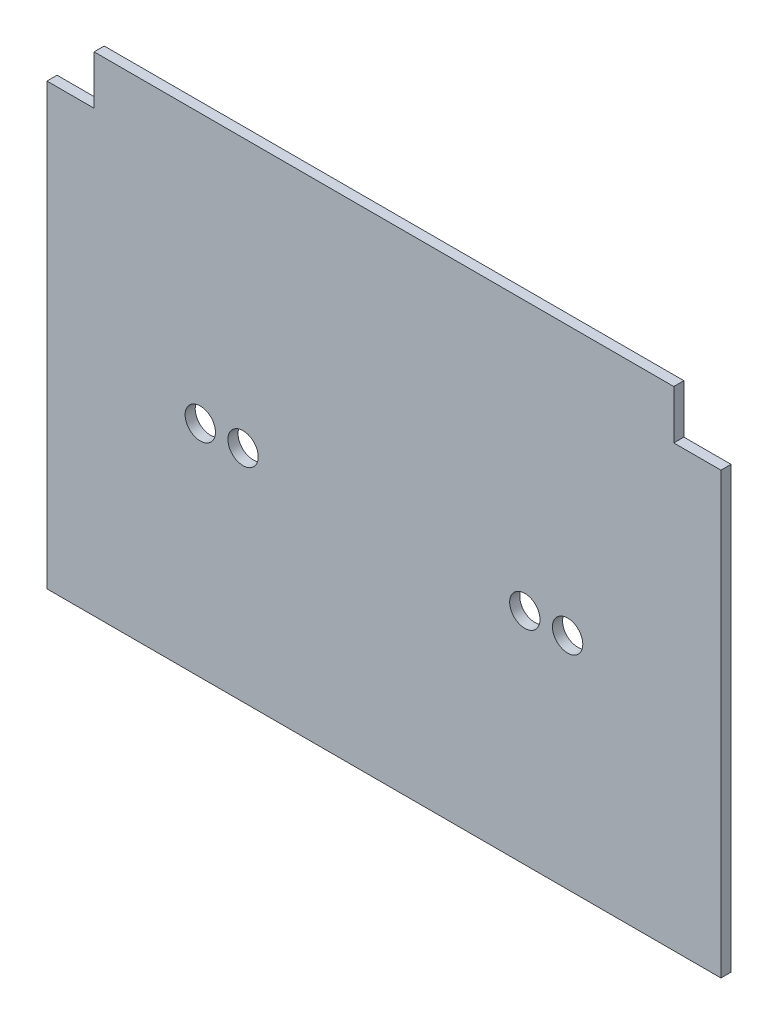
ISO-10303-21;
HEADER;
FILE_DESCRIPTION(('STEP AP214'),'2;1');
FILE_NAME('part.step','',(''),(''),'','','');
FILE_SCHEMA(('AUTOMOTIVE_DESIGN { 1 0 10303 214 1 1 1 1 }'));
ENDSEC;
DATA;
#1=APPLICATION_CONTEXT('core data for automotive mechanical design processes');
#2=APPLICATION_PROTOCOL_DEFINITION('international standard','automotive_design',2000,#1);
#3=PRODUCT_CONTEXT('',#1,'mechanical');
#4=PRODUCT('Part','Part','',(#3));
#5=PRODUCT_RELATED_PRODUCT_CATEGORY('part','',(#4));
#6=PRODUCT_DEFINITION_FORMATION('','',#4);
#7=PRODUCT_DEFINITION_CONTEXT('part definition',#1,'design');
#8=PRODUCT_DEFINITION('design','',#6,#7);
#9=PRODUCT_DEFINITION_SHAPE('','',#8);
#10=(LENGTH_UNIT() NAMED_UNIT(*) SI_UNIT(.MILLI.,.METRE.));
#11=(NAMED_UNIT(*) PLANE_ANGLE_UNIT() SI_UNIT($,.RADIAN.));
#12=(NAMED_UNIT(*) SI_UNIT($,.STERADIAN.) SOLID_ANGLE_UNIT());
#13=UNCERTAINTY_MEASURE_WITH_UNIT(LENGTH_MEASURE(1.E-05),#10,'distance_accuracy_value','');
#14=(GEOMETRIC_REPRESENTATION_CONTEXT(3) GLOBAL_UNCERTAINTY_ASSIGNED_CONTEXT((#13)) GLOBAL_UNIT_ASSIGNED_CONTEXT((#10,
#11,#12)) REPRESENTATION_CONTEXT('',''));
#15=CARTESIAN_POINT('',(0.,0.,0.));
#16=DIRECTION('',(0.,0.,1.));
#17=DIRECTION('',(1.,0.,0.));
#18=AXIS2_PLACEMENT_3D('',#15,#16,#17);
#19=CARTESIAN_POINT('',(-28.5714285714286,258.104761904762,6.));
#20=DIRECTION('',(1.,0.,0.));
#21=DIRECTION('',(0.,1.,0.));
#22=AXIS2_PLACEMENT_3D('',#19,#20,#21);
#23=PLANE('',#22);
#24=DIRECTION('',(0.,-1.,0.));
#25=VECTOR('',#24,1.);
#26=CARTESIAN_POINT('',(-28.5714285714286,258.104761904762,6.));
#27=LINE('',#26,#25);
#28=CARTESIAN_POINT('',(-28.5714285714286,238.104761904762,6.));
#29=VERTEX_POINT('',#28);
#30=CARTESIAN_POINT('',(-28.5714285714286,-22.8952380952381,6.));
#31=VERTEX_POINT('',#30);
#32=EDGE_CURVE('E143',#29,#31,#27,.T.);
#33=ORIENTED_EDGE('',*,*,#32,.F.);
#34=DIRECTION('',(0.,0.,1.));
#35=VECTOR('',#34,1.);
#36=CARTESIAN_POINT('',(-28.5714285714286,238.104761904762,-4.));
#37=LINE('',#36,#35);
#38=CARTESIAN_POINT('',(-28.5714285714286,238.104761904762,0.));
#39=VERTEX_POINT('',#38);
#40=EDGE_CURVE('E133',#39,#29,#37,.T.);
#41=ORIENTED_EDGE('',*,*,#40,.F.);
#42=DIRECTION('',(0.,-1.,0.));
#43=VECTOR('',#42,1.);
#44=CARTESIAN_POINT('',(-28.5714285714286,258.104761904762,0.));
#45=LINE('',#44,#43);
#46=CARTESIAN_POINT('',(-28.5714285714286,-22.8952380952381,0.));
#47=VERTEX_POINT('',#46);
#48=EDGE_CURVE('E135',#39,#47,#45,.T.);
#49=ORIENTED_EDGE('',*,*,#48,.T.);
#50=DIRECTION('',(0.,0.,-1.));
#51=VECTOR('',#50,1.);
#52=CARTESIAN_POINT('',(-28.5714285714286,-22.8952380952381,6.));
#53=LINE('',#52,#51);
#54=EDGE_CURVE('E106',#31,#47,#53,.T.);
#55=ORIENTED_EDGE('',*,*,#54,.F.);
#56=EDGE_LOOP('',(#33,#41,#49,#55));
#57=FACE_BOUND('',#56,.T.);
#58=ADVANCED_FACE('F33',(#57),#23,.F.);
#59=CARTESIAN_POINT('',(-28.5714285714286,-22.8952380952381,6.));
#60=DIRECTION('',(0.,1.,0.));
#61=DIRECTION('',(0.,0.,1.));
#62=AXIS2_PLACEMENT_3D('',#59,#60,#61);
#63=PLANE('',#62);
#64=DIRECTION('',(1.,0.,0.));
#65=VECTOR('',#64,1.);
#66=CARTESIAN_POINT('',(-28.5714285714286,-22.8952380952381,0.));
#67=LINE('',#66,#65);
#68=CARTESIAN_POINT('',(371.428571428571,-22.8952380952381,0.));
#69=VERTEX_POINT('',#68);
#70=EDGE_CURVE('E153',#47,#69,#67,.T.);
#71=ORIENTED_EDGE('',*,*,#70,.T.);
#72=DIRECTION('',(0.,0.,-1.));
#73=VECTOR('',#72,1.);
#74=CARTESIAN_POINT('',(371.428571428571,-22.8952380952381,6.));
#75=LINE('',#74,#73);
#76=CARTESIAN_POINT('',(371.428571428571,-22.8952380952381,6.));
#77=VERTEX_POINT('',#76);
#78=EDGE_CURVE('E151',#77,#69,#75,.T.);
#79=ORIENTED_EDGE('',*,*,#78,.F.);
#80=DIRECTION('',(1.,0.,0.));
#81=VECTOR('',#80,1.);
#82=CARTESIAN_POINT('',(-28.5714285714286,-22.8952380952381,6.));
#83=LINE('',#82,#81);
#84=EDGE_CURVE('E145',#31,#77,#83,.T.);
#85=ORIENTED_EDGE('',*,*,#84,.F.);
#86=ORIENTED_EDGE('',*,*,#54,.T.);
#87=EDGE_LOOP('',(#71,#79,#85,#86));
#88=FACE_BOUND('',#87,.T.);
#89=ADVANCED_FACE('F190',(#88),#63,.F.);
#90=CARTESIAN_POINT('',(371.428571428571,258.104761904762,6.));
#91=DIRECTION('',(-1.,0.,0.));
#92=DIRECTION('',(0.,-1.,0.));
#93=AXIS2_PLACEMENT_3D('',#90,#91,#92);
#94=PLANE('',#93);
#95=DIRECTION('',(0.,1.,0.));
#96=VECTOR('',#95,1.);
#97=CARTESIAN_POINT('',(371.428571428571,258.104761904762,0.));
#98=LINE('',#97,#96);
#99=CARTESIAN_POINT('',(371.428571428571,238.104761904762,0.));
#100=VERTEX_POINT('',#99);
#101=EDGE_CURVE('E146',#69,#100,#98,.T.);
#102=ORIENTED_EDGE('',*,*,#101,.T.);
#103=DIRECTION('',(0.,0.,1.));
#104=VECTOR('',#103,1.);
#105=CARTESIAN_POINT('',(371.428571428571,238.104761904762,-4.));
#106=LINE('',#105,#104);
#107=CARTESIAN_POINT('',(371.428571428571,238.104761904762,6.));
#108=VERTEX_POINT('',#107);
#109=EDGE_CURVE('E131',#100,#108,#106,.T.);
#110=ORIENTED_EDGE('',*,*,#109,.T.);
#111=DIRECTION('',(0.,1.,0.));
#112=VECTOR('',#111,1.);
#113=CARTESIAN_POINT('',(371.428571428571,258.104761904762,6.));
#114=LINE('',#113,#112);
#115=EDGE_CURVE('E148',#77,#108,#114,.T.);
#116=ORIENTED_EDGE('',*,*,#115,.F.);
#117=ORIENTED_EDGE('',*,*,#78,.T.);
#118=EDGE_LOOP('',(#102,#110,#116,#117));
#119=FACE_BOUND('',#118,.T.);
#120=ADVANCED_FACE('F195',(#119),#94,.F.);
#121=CARTESIAN_POINT('',(0.,0.,6.));
#122=DIRECTION('',(0.,0.,1.));
#123=DIRECTION('',(1.,0.,0.));
#124=AXIS2_PLACEMENT_3D('',#121,#122,#123);
#125=PLANE('',#124);
#126=CARTESIAN_POINT('',(62.4285714285714,107.604761904762,6.));
#127=DIRECTION('',(0.,0.,1.));
#128=DIRECTION('',(1.,0.,0.));
#129=AXIS2_PLACEMENT_3D('',#126,#127,#128);
#130=CIRCLE('',#129,8.99999999999999);
#131=CARTESIAN_POINT('',(71.4285714285714,107.604761904762,6.));
#132=VERTEX_POINT('',#131);
#133=EDGE_CURVE('E167',#132,#132,#130,.T.);
#134=ORIENTED_EDGE('',*,*,#133,.F.);
#135=EDGE_LOOP('',(#134));
#136=FACE_BOUND('',#135,.T.);
#137=CARTESIAN_POINT('',(87.8285714285714,107.604761904762,6.));
#138=DIRECTION('',(0.,0.,1.));
#139=DIRECTION('',(1.,0.,0.));
#140=AXIS2_PLACEMENT_3D('',#137,#138,#139);
#141=CIRCLE('',#140,8.99999999999999);
#142=CARTESIAN_POINT('',(96.8285714285714,107.604761904762,6.));
#143=VERTEX_POINT('',#142);
#144=EDGE_CURVE('E321',#143,#143,#141,.T.);
#145=ORIENTED_EDGE('',*,*,#144,.F.);
#146=EDGE_LOOP('',(#145));
#147=FACE_BOUND('',#146,.T.);
#148=CARTESIAN_POINT('',(255.028571428571,107.604761904762,6.));
#149=DIRECTION('',(0.,0.,1.));
#150=DIRECTION('',(1.,0.,0.));
#151=AXIS2_PLACEMENT_3D('',#148,#149,#150);
#152=CIRCLE('',#151,8.99999999999999);
#153=CARTESIAN_POINT('',(264.028571428571,107.604761904762,6.));
#154=VERTEX_POINT('',#153);
#155=EDGE_CURVE('E314',#154,#154,#152,.T.);
#156=ORIENTED_EDGE('',*,*,#155,.F.);
#157=EDGE_LOOP('',(#156));
#158=FACE_BOUND('',#157,.T.);
#159=CARTESIAN_POINT('',(280.428571428571,107.604761904762,6.));
#160=DIRECTION('',(0.,0.,1.));
#161=DIRECTION('',(1.,0.,0.));
#162=AXIS2_PLACEMENT_3D('',#159,#160,#161);
#163=CIRCLE('',#162,8.99999999999999);
#164=CARTESIAN_POINT('',(289.428571428572,107.604761904762,6.));
#165=VERTEX_POINT('',#164);
#166=EDGE_CURVE('E123',#165,#165,#163,.T.);
#167=ORIENTED_EDGE('',*,*,#166,.F.);
#168=EDGE_LOOP('',(#167));
#169=FACE_BOUND('',#168,.T.);
#170=DIRECTION('',(0.,1.,0.));
#171=VECTOR('',#170,1.);
#172=CARTESIAN_POINT('',(-0.571428571428618,258.104761904762,6.));
#173=LINE('',#172,#171);
#174=CARTESIAN_POINT('',(-0.571428571428619,238.104761904762,6.));
#175=VERTEX_POINT('',#174);
#176=CARTESIAN_POINT('',(-0.571428571428618,267.104761904762,6.));
#177=VERTEX_POINT('',#176);
#178=EDGE_CURVE('E130',#175,#177,#173,.T.);
#179=ORIENTED_EDGE('',*,*,#178,.F.);
#180=DIRECTION('',(1.,0.,0.));
#181=VECTOR('',#180,1.);
#182=CARTESIAN_POINT('',(-28.5714285714286,238.104761904762,6.));
#183=LINE('',#182,#181);
#184=EDGE_CURVE('E128',#29,#175,#183,.T.);
#185=ORIENTED_EDGE('',*,*,#184,.F.);
#186=ORIENTED_EDGE('',*,*,#32,.T.);
#187=ORIENTED_EDGE('',*,*,#84,.T.);
#188=ORIENTED_EDGE('',*,*,#115,.T.);
#189=DIRECTION('',(1.,0.,0.));
#190=VECTOR('',#189,1.);
#191=CARTESIAN_POINT('',(371.428571428571,238.104761904762,6.));
#192=LINE('',#191,#190);
#193=CARTESIAN_POINT('',(343.428571428571,238.104761904762,6.));
#194=VERTEX_POINT('',#193);
#195=EDGE_CURVE('E138',#194,#108,#192,.T.);
#196=ORIENTED_EDGE('',*,*,#195,.F.);
#197=DIRECTION('',(0.,-1.,0.));
#198=VECTOR('',#197,1.);
#199=CARTESIAN_POINT('',(343.428571428571,258.104761904762,6.));
#200=LINE('',#199,#198);
#201=CARTESIAN_POINT('',(343.428571428571,267.104761904762,6.));
#202=VERTEX_POINT('',#201);
#203=EDGE_CURVE('E126',#202,#194,#200,.T.);
#204=ORIENTED_EDGE('',*,*,#203,.F.);
#205=DIRECTION('',(-1.,0.,0.));
#206=VECTOR('',#205,1.);
#207=CARTESIAN_POINT('',(-0.571428571428618,267.104761904762,6.));
#208=LINE('',#207,#206);
#209=EDGE_CURVE('E114',#202,#177,#208,.T.);
#210=ORIENTED_EDGE('',*,*,#209,.T.);
#211=EDGE_LOOP('',(#179,#185,#186,#187,#188,#196,#204,#210));
#212=FACE_BOUND('',#211,.T.);
#213=ADVANCED_FACE('F205',(#136,#147,#158,#169,#212),#125,.T.);
#214=CARTESIAN_POINT('',(0.,0.,0.));
#215=DIRECTION('',(0.,0.,1.));
#216=DIRECTION('',(1.,0.,0.));
#217=AXIS2_PLACEMENT_3D('',#214,#215,#216);
#218=PLANE('',#217);
#219=CARTESIAN_POINT('',(62.4285714285714,107.604761904762,0.));
#220=DIRECTION('',(0.,0.,1.));
#221=DIRECTION('',(1.,0.,0.));
#222=AXIS2_PLACEMENT_3D('',#219,#220,#221);
#223=CIRCLE('',#222,8.99999999999999);
#224=CARTESIAN_POINT('',(71.4285714285714,107.604761904762,0.));
#225=VERTEX_POINT('',#224);
#226=EDGE_CURVE('E36',#225,#225,#223,.T.);
#227=ORIENTED_EDGE('',*,*,#226,.T.);
#228=EDGE_LOOP('',(#227));
#229=FACE_BOUND('',#228,.T.);
#230=CARTESIAN_POINT('',(87.8285714285714,107.604761904762,0.));
#231=DIRECTION('',(0.,0.,1.));
#232=DIRECTION('',(1.,0.,0.));
#233=AXIS2_PLACEMENT_3D('',#230,#231,#232);
#234=CIRCLE('',#233,8.99999999999999);
#235=CARTESIAN_POINT('',(96.8285714285714,107.604761904762,0.));
#236=VERTEX_POINT('',#235);
#237=EDGE_CURVE('E169',#236,#236,#234,.T.);
#238=ORIENTED_EDGE('',*,*,#237,.T.);
#239=EDGE_LOOP('',(#238));
#240=FACE_BOUND('',#239,.T.);
#241=CARTESIAN_POINT('',(255.028571428571,107.604761904762,0.));
#242=DIRECTION('',(0.,0.,1.));
#243=DIRECTION('',(1.,0.,0.));
#244=AXIS2_PLACEMENT_3D('',#241,#242,#243);
#245=CIRCLE('',#244,8.99999999999999);
#246=CARTESIAN_POINT('',(264.028571428571,107.604761904762,0.));
#247=VERTEX_POINT('',#246);
#248=EDGE_CURVE('E166',#247,#247,#245,.T.);
#249=ORIENTED_EDGE('',*,*,#248,.T.);
#250=EDGE_LOOP('',(#249));
#251=FACE_BOUND('',#250,.T.);
#252=CARTESIAN_POINT('',(280.428571428571,107.604761904762,0.));
#253=DIRECTION('',(0.,0.,1.));
#254=DIRECTION('',(1.,0.,0.));
#255=AXIS2_PLACEMENT_3D('',#252,#253,#254);
#256=CIRCLE('',#255,8.99999999999999);
#257=CARTESIAN_POINT('',(289.428571428572,107.604761904762,0.));
#258=VERTEX_POINT('',#257);
#259=EDGE_CURVE('E163',#258,#258,#256,.T.);
#260=ORIENTED_EDGE('',*,*,#259,.T.);
#261=EDGE_LOOP('',(#260));
#262=FACE_BOUND('',#261,.T.);
#263=DIRECTION('',(1.,0.,0.));
#264=VECTOR('',#263,1.);
#265=CARTESIAN_POINT('',(0.,238.104761904762,0.));
#266=LINE('',#265,#264);
#267=CARTESIAN_POINT('',(-0.571428571428619,238.104761904762,0.));
#268=VERTEX_POINT('',#267);
#269=EDGE_CURVE('E41',#39,#268,#266,.T.);
#270=ORIENTED_EDGE('',*,*,#269,.T.);
#271=DIRECTION('',(0.,1.,0.));
#272=VECTOR('',#271,1.);
#273=CARTESIAN_POINT('',(-0.571428571428631,0.,0.));
#274=LINE('',#273,#272);
#275=CARTESIAN_POINT('',(-0.571428571428618,267.104761904762,0.));
#276=VERTEX_POINT('',#275);
#277=EDGE_CURVE('E11',#268,#276,#274,.T.);
#278=ORIENTED_EDGE('',*,*,#277,.T.);
#279=DIRECTION('',(-1.,0.,0.));
#280=VECTOR('',#279,1.);
#281=CARTESIAN_POINT('',(-0.571428571428618,267.104761904762,0.));
#282=LINE('',#281,#280);
#283=CARTESIAN_POINT('',(343.428571428571,267.104761904762,0.));
#284=VERTEX_POINT('',#283);
#285=EDGE_CURVE('E112',#284,#276,#282,.T.);
#286=ORIENTED_EDGE('',*,*,#285,.F.);
#287=DIRECTION('',(0.,-1.,0.));
#288=VECTOR('',#287,1.);
#289=CARTESIAN_POINT('',(343.428571428571,0.,0.));
#290=LINE('',#289,#288);
#291=CARTESIAN_POINT('',(343.428571428571,238.104761904762,0.));
#292=VERTEX_POINT('',#291);
#293=EDGE_CURVE('E97',#284,#292,#290,.T.);
#294=ORIENTED_EDGE('',*,*,#293,.T.);
#295=DIRECTION('',(1.,0.,0.));
#296=VECTOR('',#295,1.);
#297=CARTESIAN_POINT('',(-2.36026240124604E-13,238.104761904762,0.));
#298=LINE('',#297,#296);
#299=EDGE_CURVE('E105',#292,#100,#298,.T.);
#300=ORIENTED_EDGE('',*,*,#299,.T.);
#301=ORIENTED_EDGE('',*,*,#101,.F.);
#302=ORIENTED_EDGE('',*,*,#70,.F.);
#303=ORIENTED_EDGE('',*,*,#48,.F.);
#304=EDGE_LOOP('',(#270,#278,#286,#294,#300,#301,#302,#303));
#305=FACE_BOUND('',#304,.T.);
#306=ADVANCED_FACE('F118',(#229,#240,#251,#262,#305),#218,.F.);
#307=CARTESIAN_POINT('',(371.428571428571,238.104761904762,-4.));
#308=DIRECTION('',(0.,-1.,0.));
#309=DIRECTION('',(1.,0.,0.));
#310=AXIS2_PLACEMENT_3D('',#307,#308,#309);
#311=PLANE('',#310);
#312=DIRECTION('',(0.,0.,1.));
#313=VECTOR('',#312,1.);
#314=CARTESIAN_POINT('',(343.428571428571,238.104761904762,-4.));
#315=LINE('',#314,#313);
#316=EDGE_CURVE('E57',#292,#194,#315,.T.);
#317=ORIENTED_EDGE('',*,*,#316,.T.);
#318=ORIENTED_EDGE('',*,*,#195,.T.);
#319=ORIENTED_EDGE('',*,*,#109,.F.);
#320=ORIENTED_EDGE('',*,*,#299,.F.);
#321=EDGE_LOOP('',(#317,#318,#319,#320));
#322=FACE_BOUND('',#321,.T.);
#323=ADVANCED_FACE('F213',(#322),#311,.F.);
#324=CARTESIAN_POINT('',(343.428571428571,258.104761904762,-4.));
#325=DIRECTION('',(-1.,0.,0.));
#326=DIRECTION('',(0.,0.,1.));
#327=AXIS2_PLACEMENT_3D('',#324,#325,#326);
#328=PLANE('',#327);
#329=ORIENTED_EDGE('',*,*,#293,.F.);
#330=DIRECTION('',(0.,0.,1.));
#331=VECTOR('',#330,1.);
#332=CARTESIAN_POINT('',(343.428571428571,267.104761904762,0.));
#333=LINE('',#332,#331);
#334=EDGE_CURVE('E100',#284,#202,#333,.T.);
#335=ORIENTED_EDGE('',*,*,#334,.T.);
#336=ORIENTED_EDGE('',*,*,#203,.T.);
#337=ORIENTED_EDGE('',*,*,#316,.F.);
#338=EDGE_LOOP('',(#329,#335,#336,#337));
#339=FACE_BOUND('',#338,.T.);
#340=ADVANCED_FACE('F99',(#339),#328,.F.);
#341=CARTESIAN_POINT('',(-0.571428571428618,258.104761904762,-4.));
#342=DIRECTION('',(1.,0.,0.));
#343=DIRECTION('',(0.,1.,0.));
#344=AXIS2_PLACEMENT_3D('',#341,#342,#343);
#345=PLANE('',#344);
#346=DIRECTION('',(0.,0.,1.));
#347=VECTOR('',#346,1.);
#348=CARTESIAN_POINT('',(-0.571428571428619,238.104761904762,-4.));
#349=LINE('',#348,#347);
#350=EDGE_CURVE('E49',#268,#175,#349,.T.);
#351=ORIENTED_EDGE('',*,*,#350,.T.);
#352=ORIENTED_EDGE('',*,*,#178,.T.);
#353=DIRECTION('',(0.,0.,1.));
#354=VECTOR('',#353,1.);
#355=CARTESIAN_POINT('',(-0.571428571428618,267.104761904762,0.));
#356=LINE('',#355,#354);
#357=EDGE_CURVE('E115',#276,#177,#356,.T.);
#358=ORIENTED_EDGE('',*,*,#357,.F.);
#359=ORIENTED_EDGE('',*,*,#277,.F.);
#360=EDGE_LOOP('',(#351,#352,#358,#359));
#361=FACE_BOUND('',#360,.T.);
#362=ADVANCED_FACE('F216',(#361),#345,.F.);
#363=CARTESIAN_POINT('',(-28.5714285714286,238.104761904762,-4.));
#364=DIRECTION('',(0.,-1.,0.));
#365=DIRECTION('',(0.,0.,-1.));
#366=AXIS2_PLACEMENT_3D('',#363,#364,#365);
#367=PLANE('',#366);
#368=ORIENTED_EDGE('',*,*,#40,.T.);
#369=ORIENTED_EDGE('',*,*,#184,.T.);
#370=ORIENTED_EDGE('',*,*,#350,.F.);
#371=ORIENTED_EDGE('',*,*,#269,.F.);
#372=EDGE_LOOP('',(#368,#369,#370,#371));
#373=FACE_BOUND('',#372,.T.);
#374=ADVANCED_FACE('F214',(#373),#367,.F.);
#375=CARTESIAN_POINT('',(-0.571428571428618,267.104761904762,0.));
#376=DIRECTION('',(0.,1.,0.));
#377=DIRECTION('',(0.,0.,1.));
#378=AXIS2_PLACEMENT_3D('',#375,#376,#377);
#379=PLANE('',#378);
#380=ORIENTED_EDGE('',*,*,#209,.F.);
#381=ORIENTED_EDGE('',*,*,#334,.F.);
#382=ORIENTED_EDGE('',*,*,#285,.T.);
#383=ORIENTED_EDGE('',*,*,#357,.T.);
#384=EDGE_LOOP('',(#380,#381,#382,#383));
#385=FACE_BOUND('',#384,.T.);
#386=ADVANCED_FACE('F110',(#385),#379,.T.);
#387=CARTESIAN_POINT('',(280.428571428571,107.604761904762,-4.));
#388=DIRECTION('',(0.,0.,1.));
#389=DIRECTION('',(1.,0.,0.));
#390=AXIS2_PLACEMENT_3D('',#387,#388,#389);
#391=CYLINDRICAL_SURFACE('',#390,8.99999999999999);
#392=ORIENTED_EDGE('',*,*,#166,.T.);
#393=EDGE_LOOP('',(#392));
#394=FACE_BOUND('',#393,.T.);
#395=ORIENTED_EDGE('',*,*,#259,.F.);
#396=EDGE_LOOP('',(#395));
#397=FACE_BOUND('',#396,.T.);
#398=ADVANCED_FACE('F281',(#394,#397),#391,.F.);
#399=CARTESIAN_POINT('',(255.028571428571,107.604761904762,-4.));
#400=DIRECTION('',(0.,0.,1.));
#401=DIRECTION('',(1.,0.,0.));
#402=AXIS2_PLACEMENT_3D('',#399,#400,#401);
#403=CYLINDRICAL_SURFACE('',#402,8.99999999999999);
#404=ORIENTED_EDGE('',*,*,#155,.T.);
#405=EDGE_LOOP('',(#404));
#406=FACE_BOUND('',#405,.T.);
#407=ORIENTED_EDGE('',*,*,#248,.F.);
#408=EDGE_LOOP('',(#407));
#409=FACE_BOUND('',#408,.T.);
#410=ADVANCED_FACE('F185',(#406,#409),#403,.F.);
#411=CARTESIAN_POINT('',(87.8285714285714,107.604761904762,-4.));
#412=DIRECTION('',(0.,0.,1.));
#413=DIRECTION('',(1.,0.,0.));
#414=AXIS2_PLACEMENT_3D('',#411,#412,#413);
#415=CYLINDRICAL_SURFACE('',#414,8.99999999999999);
#416=ORIENTED_EDGE('',*,*,#144,.T.);
#417=EDGE_LOOP('',(#416));
#418=FACE_BOUND('',#417,.T.);
#419=ORIENTED_EDGE('',*,*,#237,.F.);
#420=EDGE_LOOP('',(#419));
#421=FACE_BOUND('',#420,.T.);
#422=ADVANCED_FACE('F179',(#418,#421),#415,.F.);
#423=CARTESIAN_POINT('',(62.4285714285714,107.604761904762,-4.));
#424=DIRECTION('',(0.,0.,1.));
#425=DIRECTION('',(1.,0.,0.));
#426=AXIS2_PLACEMENT_3D('',#423,#424,#425);
#427=CYLINDRICAL_SURFACE('',#426,8.99999999999999);
#428=ORIENTED_EDGE('',*,*,#133,.T.);
#429=EDGE_LOOP('',(#428));
#430=FACE_BOUND('',#429,.T.);
#431=ORIENTED_EDGE('',*,*,#226,.F.);
#432=EDGE_LOOP('',(#431));
#433=FACE_BOUND('',#432,.T.);
#434=ADVANCED_FACE('F177',(#430,#433),#427,.F.);
#435=CLOSED_SHELL('',(#58,#89,#120,#213,#306,#323,#340,#362,#374,#386,#398,#410,#422,#434));
#436=MANIFOLD_SOLID_BREP('B2',#435);
#437=ADVANCED_BREP_SHAPE_REPRESENTATION('',(#18,#436),#14);
#438=SHAPE_DEFINITION_REPRESENTATION(#9,#437);
ENDSEC;
END-ISO-10303-21;
